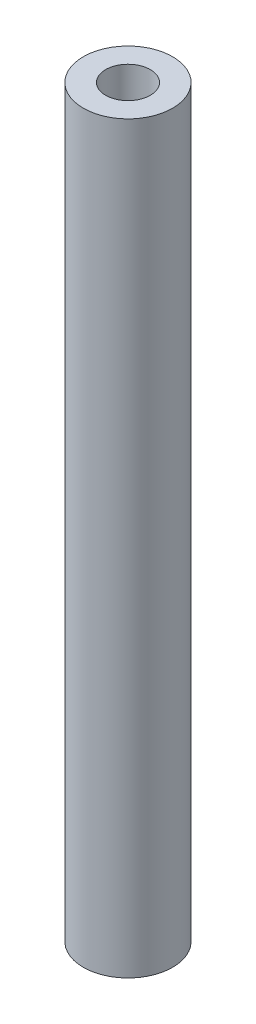
ISO-10303-21;
HEADER;
FILE_DESCRIPTION(('STEP AP214'),'2;1');
FILE_NAME('part.step','',(''),(''),'','','');
FILE_SCHEMA(('AUTOMOTIVE_DESIGN { 1 0 10303 214 1 1 1 1 }'));
ENDSEC;
DATA;
#1=APPLICATION_CONTEXT('core data for automotive mechanical design processes');
#2=APPLICATION_PROTOCOL_DEFINITION('international standard','automotive_design',2000,#1);
#3=PRODUCT_CONTEXT('',#1,'mechanical');
#4=PRODUCT('Part','Part','',(#3));
#5=PRODUCT_RELATED_PRODUCT_CATEGORY('part','',(#4));
#6=PRODUCT_DEFINITION_FORMATION('','',#4);
#7=PRODUCT_DEFINITION_CONTEXT('part definition',#1,'design');
#8=PRODUCT_DEFINITION('design','',#6,#7);
#9=PRODUCT_DEFINITION_SHAPE('','',#8);
#10=(LENGTH_UNIT() NAMED_UNIT(*) SI_UNIT(.MILLI.,.METRE.));
#11=(NAMED_UNIT(*) PLANE_ANGLE_UNIT() SI_UNIT($,.RADIAN.));
#12=(NAMED_UNIT(*) SI_UNIT($,.STERADIAN.) SOLID_ANGLE_UNIT());
#13=UNCERTAINTY_MEASURE_WITH_UNIT(LENGTH_MEASURE(1.E-05),#10,'distance_accuracy_value','');
#14=(GEOMETRIC_REPRESENTATION_CONTEXT(3) GLOBAL_UNCERTAINTY_ASSIGNED_CONTEXT((#13)) GLOBAL_UNIT_ASSIGNED_CONTEXT((#10,
#11,#12)) REPRESENTATION_CONTEXT('',''));
#15=CARTESIAN_POINT('',(0.,0.,0.));
#16=DIRECTION('',(0.,0.,1.));
#17=DIRECTION('',(1.,0.,0.));
#18=AXIS2_PLACEMENT_3D('',#15,#16,#17);
#19=CARTESIAN_POINT('',(0.,50.,0.));
#20=DIRECTION('',(0.,1.,0.));
#21=DIRECTION('',(0.,0.,1.));
#22=AXIS2_PLACEMENT_3D('',#19,#20,#21);
#23=PLANE('',#22);
#24=CARTESIAN_POINT('',(0.,50.,0.));
#25=DIRECTION('',(0.,1.,0.));
#26=DIRECTION('',(0.,0.,1.));
#27=AXIS2_PLACEMENT_3D('',#24,#25,#26);
#28=CIRCLE('',#27,3.);
#29=CARTESIAN_POINT('',(0.,50.,3.));
#30=VERTEX_POINT('',#29);
#31=EDGE_CURVE('E10',#30,#30,#28,.T.);
#32=ORIENTED_EDGE('',*,*,#31,.T.);
#33=EDGE_LOOP('',(#32));
#34=FACE_BOUND('',#33,.T.);
#35=CARTESIAN_POINT('',(0.,50.,0.));
#36=DIRECTION('',(0.,1.,0.));
#37=DIRECTION('',(0.,0.,1.));
#38=AXIS2_PLACEMENT_3D('',#35,#36,#37);
#39=CIRCLE('',#38,1.5);
#40=CARTESIAN_POINT('',(0.,50.,1.5));
#41=VERTEX_POINT('',#40);
#42=EDGE_CURVE('E48',#41,#41,#39,.T.);
#43=ORIENTED_EDGE('',*,*,#42,.F.);
#44=EDGE_LOOP('',(#43));
#45=FACE_BOUND('',#44,.T.);
#46=ADVANCED_FACE('F37',(#34,#45),#23,.T.);
#47=CARTESIAN_POINT('',(0.,0.,0.));
#48=DIRECTION('',(0.,1.,0.));
#49=DIRECTION('',(0.,0.,1.));
#50=AXIS2_PLACEMENT_3D('',#47,#48,#49);
#51=PLANE('',#50);
#52=CARTESIAN_POINT('',(0.,0.,0.));
#53=DIRECTION('',(0.,1.,0.));
#54=DIRECTION('',(0.,0.,1.));
#55=AXIS2_PLACEMENT_3D('',#52,#53,#54);
#56=CIRCLE('',#55,3.);
#57=CARTESIAN_POINT('',(0.,0.,3.));
#58=VERTEX_POINT('',#57);
#59=EDGE_CURVE('E41',#58,#58,#56,.T.);
#60=ORIENTED_EDGE('',*,*,#59,.F.);
#61=EDGE_LOOP('',(#60));
#62=FACE_BOUND('',#61,.T.);
#63=CARTESIAN_POINT('',(0.,0.,0.));
#64=DIRECTION('',(0.,1.,0.));
#65=DIRECTION('',(0.,0.,1.));
#66=AXIS2_PLACEMENT_3D('',#63,#64,#65);
#67=CIRCLE('',#66,1.5);
#68=CARTESIAN_POINT('',(0.,0.,1.5));
#69=VERTEX_POINT('',#68);
#70=EDGE_CURVE('E50',#69,#69,#67,.T.);
#71=ORIENTED_EDGE('',*,*,#70,.T.);
#72=EDGE_LOOP('',(#71));
#73=FACE_BOUND('',#72,.T.);
#74=ADVANCED_FACE('F60',(#62,#73),#51,.F.);
#75=CARTESIAN_POINT('',(0.,50.,0.));
#76=DIRECTION('',(0.,-1.,0.));
#77=DIRECTION('',(0.,0.,-1.));
#78=AXIS2_PLACEMENT_3D('',#75,#76,#77);
#79=CYLINDRICAL_SURFACE('',#78,3.);
#80=ORIENTED_EDGE('',*,*,#31,.F.);
#81=EDGE_LOOP('',(#80));
#82=FACE_BOUND('',#81,.T.);
#83=ORIENTED_EDGE('',*,*,#59,.T.);
#84=EDGE_LOOP('',(#83));
#85=FACE_BOUND('',#84,.T.);
#86=ADVANCED_FACE('F39',(#82,#85),#79,.T.);
#87=CARTESIAN_POINT('',(0.,50.,0.));
#88=DIRECTION('',(0.,-1.,0.));
#89=DIRECTION('',(0.,0.,-1.));
#90=AXIS2_PLACEMENT_3D('',#87,#88,#89);
#91=CYLINDRICAL_SURFACE('',#90,1.5);
#92=ORIENTED_EDGE('',*,*,#42,.T.);
#93=EDGE_LOOP('',(#92));
#94=FACE_BOUND('',#93,.T.);
#95=ORIENTED_EDGE('',*,*,#70,.F.);
#96=EDGE_LOOP('',(#95));
#97=FACE_BOUND('',#96,.T.);
#98=ADVANCED_FACE('F56',(#94,#97),#91,.F.);
#99=CLOSED_SHELL('',(#46,#74,#86,#98));
#100=MANIFOLD_SOLID_BREP('B2',#99);
#101=ADVANCED_BREP_SHAPE_REPRESENTATION('',(#18,#100),#14);
#102=SHAPE_DEFINITION_REPRESENTATION(#9,#101);
ENDSEC;
END-ISO-10303-21;
